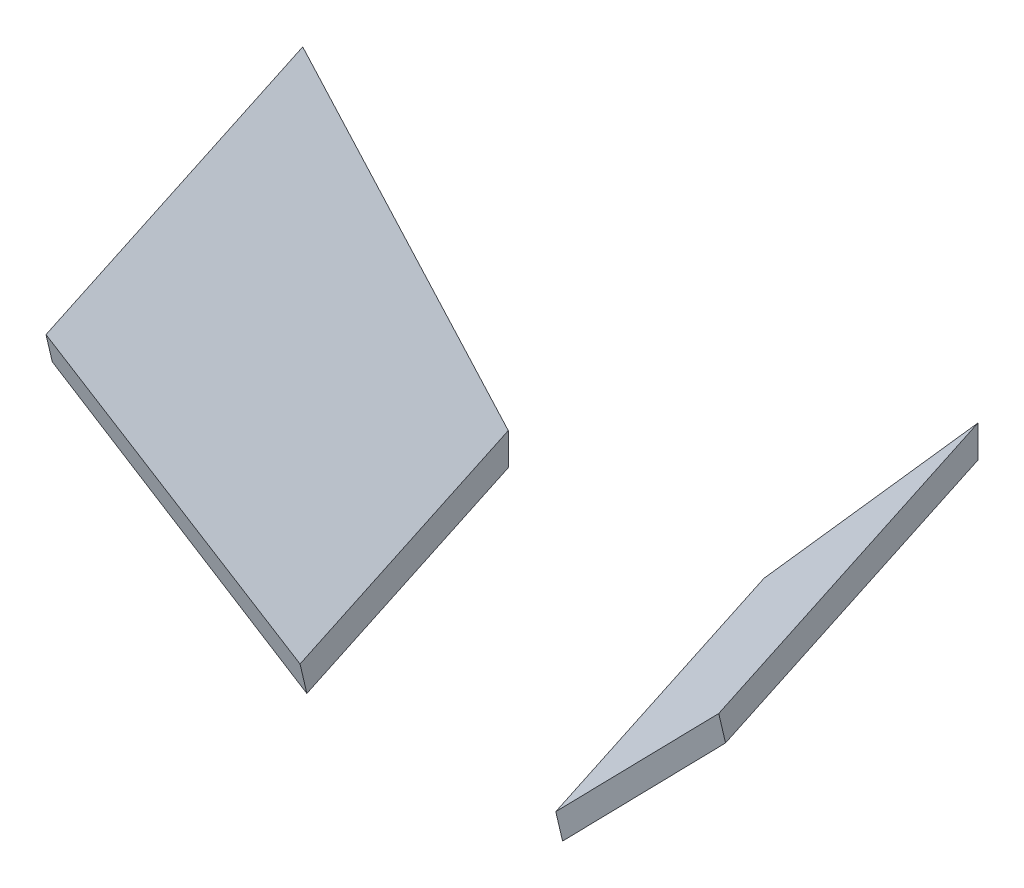
ISO-10303-21;
HEADER;
FILE_DESCRIPTION(('STEP AP214'),'2;1');
FILE_NAME('part.step','',(''),(''),'','','');
FILE_SCHEMA(('AUTOMOTIVE_DESIGN { 1 0 10303 214 1 1 1 1 }'));
ENDSEC;
DATA;
#1=APPLICATION_CONTEXT('core data for automotive mechanical design processes');
#2=APPLICATION_PROTOCOL_DEFINITION('international standard','automotive_design',2000,#1);
#3=PRODUCT_CONTEXT('',#1,'mechanical');
#4=PRODUCT('Part','Part','',(#3));
#5=PRODUCT_RELATED_PRODUCT_CATEGORY('part','',(#4));
#6=PRODUCT_DEFINITION_FORMATION('','',#4);
#7=PRODUCT_DEFINITION_CONTEXT('part definition',#1,'design');
#8=PRODUCT_DEFINITION('design','',#6,#7);
#9=PRODUCT_DEFINITION_SHAPE('','',#8);
#10=(LENGTH_UNIT() NAMED_UNIT(*) SI_UNIT(.MILLI.,.METRE.));
#11=(NAMED_UNIT(*) PLANE_ANGLE_UNIT() SI_UNIT($,.RADIAN.));
#12=(NAMED_UNIT(*) SI_UNIT($,.STERADIAN.) SOLID_ANGLE_UNIT());
#13=UNCERTAINTY_MEASURE_WITH_UNIT(LENGTH_MEASURE(1.E-05),#10,'distance_accuracy_value','');
#14=(GEOMETRIC_REPRESENTATION_CONTEXT(3) GLOBAL_UNCERTAINTY_ASSIGNED_CONTEXT((#13)) GLOBAL_UNIT_ASSIGNED_CONTEXT((#10,
#11,#12)) REPRESENTATION_CONTEXT('',''));
#15=CARTESIAN_POINT('',(0.,0.,0.));
#16=DIRECTION('',(0.,0.,1.));
#17=DIRECTION('',(1.,0.,0.));
#18=AXIS2_PLACEMENT_3D('',#15,#16,#17);
#19=CARTESIAN_POINT('',(189.706249999992,-322.822950045939,490.018989828627));
#20=DIRECTION('',(0.714509515472125,0.633034438721973,0.297898559398576));
#21=DIRECTION('',(-0.663142756427961,0.748492942249375,0.));
#22=AXIS2_PLACEMENT_3D('',#19,#20,#21);
#23=PLANE('',#22);
#24=DIRECTION('',(0.691694025098394,-0.703106373829909,-0.164926658618121));
#25=VECTOR('',#24,1.);
#26=CARTESIAN_POINT('',(225.284806317489,-213.125185193756,171.576093597814));
#27=LINE('',#26,#25);
#28=CARTESIAN_POINT('',(5.95312499998593,9.82527775874656,223.873265492055));
#29=VERTEX_POINT('',#28);
#30=CARTESIAN_POINT('',(189.706249999992,-176.95961369711,180.059400087366));
#31=VERTEX_POINT('',#30);
#32=EDGE_CURVE('E105',#29,#31,#27,.T.);
#33=ORIENTED_EDGE('',*,*,#32,.F.);
#34=DIRECTION('',(0.,0.42579703632988,-0.904818702200994));
#35=VECTOR('',#34,1.);
#36=CARTESIAN_POINT('',(5.95312499998593,-115.419768987876,490.018989828627));
#37=LINE('',#36,#35);
#38=CARTESIAN_POINT('',(5.95312499998593,115.177402696184,0.));
#39=VERTEX_POINT('',#38);
#40=EDGE_CURVE('E12',#29,#39,#37,.T.);
#41=ORIENTED_EDGE('',*,*,#40,.T.);
#42=DIRECTION('',(0.663142756427961,-0.748492942249375,0.));
#43=VECTOR('',#42,1.);
#44=CARTESIAN_POINT('',(189.706249999992,-92.2257783618793,0.));
#45=LINE('',#44,#43);
#46=CARTESIAN_POINT('',(189.706249999992,-92.2257783618793,0.));
#47=VERTEX_POINT('',#46);
#48=EDGE_CURVE('E59',#39,#47,#45,.T.);
#49=ORIENTED_EDGE('',*,*,#48,.T.);
#50=DIRECTION('',(0.,0.42579703632988,-0.904818702200994));
#51=VECTOR('',#50,1.);
#52=CARTESIAN_POINT('',(189.706249999992,-322.822950045939,490.018989828627));
#53=LINE('',#52,#51);
#54=EDGE_CURVE('E112',#31,#47,#53,.T.);
#55=ORIENTED_EDGE('',*,*,#54,.F.);
#56=EDGE_LOOP('',(#33,#41,#49,#55));
#57=FACE_BOUND('',#56,.T.);
#58=ADVANCED_FACE('F49',(#57),#23,.F.);
#59=CARTESIAN_POINT('',(189.706249999992,-294.09717168406,490.018989828627));
#60=DIRECTION('',(-1.,0.,0.));
#61=DIRECTION('',(0.,-1.,0.));
#62=AXIS2_PLACEMENT_3D('',#59,#60,#61);
#63=PLANE('',#62);
#64=DIRECTION('',(0.,0.973574424425513,0.228369963227504));
#65=VECTOR('',#64,1.);
#66=CARTESIAN_POINT('',(189.706249999992,-219.073201766651,170.180875839469));
#67=LINE('',#66,#65);
#68=CARTESIAN_POINT('',(189.706249999992,-151.089511966093,186.127712927948));
#69=VERTEX_POINT('',#68);
#70=EDGE_CURVE('E109',#31,#69,#67,.T.);
#71=ORIENTED_EDGE('',*,*,#70,.F.);
#72=ORIENTED_EDGE('',*,*,#54,.T.);
#73=DIRECTION('',(0.,1.,0.));
#74=VECTOR('',#73,1.);
#75=CARTESIAN_POINT('',(189.706249999992,-63.4999999999998,0.));
#76=LINE('',#75,#74);
#77=CARTESIAN_POINT('',(189.706249999992,-63.4999999999998,0.));
#78=VERTEX_POINT('',#77);
#79=EDGE_CURVE('E119',#47,#78,#76,.T.);
#80=ORIENTED_EDGE('',*,*,#79,.T.);
#81=DIRECTION('',(0.,0.42579703632988,-0.904818702200994));
#82=VECTOR('',#81,1.);
#83=CARTESIAN_POINT('',(189.706249999992,-294.09717168406,490.018989828627));
#84=LINE('',#83,#82);
#85=EDGE_CURVE('E86',#69,#78,#84,.T.);
#86=ORIENTED_EDGE('',*,*,#85,.F.);
#87=EDGE_LOOP('',(#71,#72,#80,#86));
#88=FACE_BOUND('',#87,.T.);
#89=ADVANCED_FACE('F122',(#88),#63,.F.);
#90=CARTESIAN_POINT('',(189.706249999992,-294.09717168406,490.018989828627));
#91=DIRECTION('',(-0.710714360774877,-0.636522495358165,-0.299539997815607));
#92=DIRECTION('',(0.667155791785087,-0.744918216643689,0.));
#93=AXIS2_PLACEMENT_3D('',#90,#91,#92);
#94=PLANE('',#93);
#95=DIRECTION('',(-0.695588381364618,0.699455331281253,0.164070238778343));
#96=VECTOR('',#95,1.);
#97=CARTESIAN_POINT('',(224.602497060017,-186.179755997999,177.896644467066));
#98=LINE('',#97,#96);
#99=CARTESIAN_POINT('',(5.95312499998594,33.6851426488933,229.470039945935));
#100=VERTEX_POINT('',#99);
#101=EDGE_CURVE('E81',#69,#100,#98,.T.);
#102=ORIENTED_EDGE('',*,*,#101,.F.);
#103=ORIENTED_EDGE('',*,*,#85,.T.);
#104=DIRECTION('',(-0.667155791785087,0.744918216643689,0.));
#105=VECTOR('',#104,1.);
#106=CARTESIAN_POINT('',(189.706249999992,-63.4999999999998,0.));
#107=LINE('',#106,#105);
#108=CARTESIAN_POINT('',(5.95312499998594,141.671043799922,0.));
#109=VERTEX_POINT('',#108);
#110=EDGE_CURVE('E99',#78,#109,#107,.T.);
#111=ORIENTED_EDGE('',*,*,#110,.T.);
#112=DIRECTION('',(0.,0.42579703632988,-0.904818702200994));
#113=VECTOR('',#112,1.);
#114=CARTESIAN_POINT('',(5.95312499998594,-88.9261278841382,490.018989828627));
#115=LINE('',#114,#113);
#116=EDGE_CURVE('E93',#100,#109,#115,.T.);
#117=ORIENTED_EDGE('',*,*,#116,.F.);
#118=EDGE_LOOP('',(#102,#103,#111,#117));
#119=FACE_BOUND('',#118,.T.);
#120=ADVANCED_FACE('F102',(#119),#94,.F.);
#121=CARTESIAN_POINT('',(5.95312499998594,-88.9261278841382,490.018989828627));
#122=DIRECTION('',(1.,0.,0.));
#123=DIRECTION('',(0.,1.,0.));
#124=AXIS2_PLACEMENT_3D('',#121,#122,#123);
#125=PLANE('',#124);
#126=DIRECTION('',(0.,-0.973574424425513,-0.228369963227504));
#127=VECTOR('',#126,1.);
#128=CARTESIAN_POINT('',(5.95312499998592,-24.6024106081064,215.797611767908));
#129=LINE('',#128,#127);
#130=EDGE_CURVE('E98',#100,#29,#129,.T.);
#131=ORIENTED_EDGE('',*,*,#130,.F.);
#132=ORIENTED_EDGE('',*,*,#116,.T.);
#133=DIRECTION('',(0.,-1.,0.));
#134=VECTOR('',#133,1.);
#135=CARTESIAN_POINT('',(5.95312499998594,141.671043799922,0.));
#136=LINE('',#135,#134);
#137=EDGE_CURVE('E53',#109,#39,#136,.T.);
#138=ORIENTED_EDGE('',*,*,#137,.T.);
#139=ORIENTED_EDGE('',*,*,#40,.F.);
#140=EDGE_LOOP('',(#131,#132,#138,#139));
#141=FACE_BOUND('',#140,.T.);
#142=ADVANCED_FACE('F94',(#141),#125,.F.);
#143=CARTESIAN_POINT('',(0.,0.,0.));
#144=DIRECTION('',(0.,0.,1.));
#145=DIRECTION('',(1.,0.,0.));
#146=AXIS2_PLACEMENT_3D('',#143,#144,#145);
#147=PLANE('',#146);
#148=ORIENTED_EDGE('',*,*,#48,.F.);
#149=ORIENTED_EDGE('',*,*,#137,.F.);
#150=ORIENTED_EDGE('',*,*,#110,.F.);
#151=ORIENTED_EDGE('',*,*,#79,.F.);
#152=EDGE_LOOP('',(#148,#149,#150,#151));
#153=FACE_BOUND('',#152,.T.);
#154=ADVANCED_FACE('F51',(#153),#147,.F.);
#155=CARTESIAN_POINT('',(-5.37065203274943E-12,189.67011484436,266.059212248137));
#156=DIRECTION('',(0.,-0.228369963227504,0.973574424425513));
#157=DIRECTION('',(-1.,0.,0.));
#158=AXIS2_PLACEMENT_3D('',#155,#156,#157);
#159=PLANE('',#158);
#160=ORIENTED_EDGE('',*,*,#130,.T.);
#161=ORIENTED_EDGE('',*,*,#32,.T.);
#162=ORIENTED_EDGE('',*,*,#70,.T.);
#163=ORIENTED_EDGE('',*,*,#101,.T.);
#164=EDGE_LOOP('',(#160,#161,#162,#163));
#165=FACE_BOUND('',#164,.T.);
#166=ADVANCED_FACE('F130',(#165),#159,.T.);
#167=CLOSED_SHELL('',(#58,#89,#120,#142,#154,#166));
#168=MANIFOLD_SOLID_BREP('B2',#167);
#169=CARTESIAN_POINT('',(418.306249999992,-294.09717168406,490.018989828627));
#170=DIRECTION('',(1.,0.,0.));
#171=DIRECTION('',(0.,0.,-1.));
#172=AXIS2_PLACEMENT_3D('',#169,#170,#171);
#173=PLANE('',#172);
#174=DIRECTION('',(0.,-0.973574424425513,-0.228369963227504));
#175=VECTOR('',#174,1.);
#176=CARTESIAN_POINT('',(418.306249999992,-219.073201766651,170.180875839469));
#177=LINE('',#176,#175);
#178=CARTESIAN_POINT('',(418.306249999992,-151.089511966093,186.127712927948));
#179=VERTEX_POINT('',#178);
#180=CARTESIAN_POINT('',(418.306249999992,-176.95961369711,180.059400087366));
#181=VERTEX_POINT('',#180);
#182=EDGE_CURVE('E223',#179,#181,#177,.T.);
#183=ORIENTED_EDGE('',*,*,#182,.F.);
#184=DIRECTION('',(0.,0.42579703632988,-0.904818702200994));
#185=VECTOR('',#184,1.);
#186=CARTESIAN_POINT('',(418.306249999992,-294.09717168406,490.018989828627));
#187=LINE('',#186,#185);
#188=CARTESIAN_POINT('',(418.306249999992,-63.5,0.));
#189=VERTEX_POINT('',#188);
#190=EDGE_CURVE('E177',#179,#189,#187,.T.);
#191=ORIENTED_EDGE('',*,*,#190,.T.);
#192=DIRECTION('',(0.,-1.,0.));
#193=VECTOR('',#192,1.);
#194=CARTESIAN_POINT('',(418.306249999992,-63.5,0.));
#195=LINE('',#194,#193);
#196=CARTESIAN_POINT('',(418.306249999992,-92.2257783618795,0.));
#197=VERTEX_POINT('',#196);
#198=EDGE_CURVE('E221',#189,#197,#195,.T.);
#199=ORIENTED_EDGE('',*,*,#198,.T.);
#200=DIRECTION('',(0.,0.42579703632988,-0.904818702200994));
#201=VECTOR('',#200,1.);
#202=CARTESIAN_POINT('',(418.306249999992,-322.822950045939,490.018989828627));
#203=LINE('',#202,#201);
#204=EDGE_CURVE('E212',#181,#197,#203,.T.);
#205=ORIENTED_EDGE('',*,*,#204,.F.);
#206=EDGE_LOOP('',(#183,#191,#199,#205));
#207=FACE_BOUND('',#206,.T.);
#208=ADVANCED_FACE('F173',(#207),#173,.F.);
#209=CARTESIAN_POINT('',(418.306249999992,-322.822950045939,490.018989828627));
#210=DIRECTION('',(-0.71448630805304,0.633055883238171,0.29790865093561));
#211=DIRECTION('',(-0.663167408730002,-0.74847110030938,0.));
#212=AXIS2_PLACEMENT_3D('',#209,#210,#211);
#213=PLANE('',#212);
#214=DIRECTION('',(0.691717963279018,0.703084051637308,0.164921422533261));
#215=VECTOR('',#214,1.);
#216=CARTESIAN_POINT('',(382.727591963731,-213.122888864018,171.576632244603));
#217=LINE('',#216,#215);
#218=CARTESIAN_POINT('',(609.599999999992,17.477414026345,225.668216175024));
#219=VERTEX_POINT('',#218);
#220=EDGE_CURVE('E182',#181,#219,#217,.T.);
#221=ORIENTED_EDGE('',*,*,#220,.F.);
#222=ORIENTED_EDGE('',*,*,#204,.T.);
#223=DIRECTION('',(0.663167408730002,0.74847110030938,0.));
#224=VECTOR('',#223,1.);
#225=CARTESIAN_POINT('',(418.306249999992,-92.2257783618795,0.));
#226=LINE('',#225,#224);
#227=CARTESIAN_POINT('',(609.599999999992,123.674221638121,0.));
#228=VERTEX_POINT('',#227);
#229=EDGE_CURVE('E233',#197,#228,#226,.T.);
#230=ORIENTED_EDGE('',*,*,#229,.T.);
#231=DIRECTION('',(0.,0.42579703632988,-0.904818702200994));
#232=VECTOR('',#231,1.);
#233=CARTESIAN_POINT('',(609.599999999992,-106.922950045939,490.018989828627));
#234=LINE('',#233,#232);
#235=EDGE_CURVE('E242',#219,#228,#234,.T.);
#236=ORIENTED_EDGE('',*,*,#235,.F.);
#237=EDGE_LOOP('',(#221,#222,#230,#236));
#238=FACE_BOUND('',#237,.T.);
#239=ADVANCED_FACE('F246',(#238),#213,.F.);
#240=CARTESIAN_POINT('',(609.599999999992,-78.1971716840599,490.018989828627));
#241=DIRECTION('',(-1.,0.,0.));
#242=DIRECTION('',(0.,-1.,0.));
#243=AXIS2_PLACEMENT_3D('',#240,#241,#242);
#244=PLANE('',#243);
#245=DIRECTION('',(0.,0.973574424425513,0.228369963227504));
#246=VECTOR('',#245,1.);
#247=CARTESIAN_POINT('',(609.599999999992,-14.4329999452193,218.183035913062));
#248=LINE('',#247,#246);
#249=CARTESIAN_POINT('',(609.599999999992,43.3475157573619,231.736529015606));
#250=VERTEX_POINT('',#249);
#251=EDGE_CURVE('E47',#219,#250,#248,.T.);
#252=ORIENTED_EDGE('',*,*,#251,.F.);
#253=ORIENTED_EDGE('',*,*,#235,.T.);
#254=DIRECTION('',(0.,1.,0.));
#255=VECTOR('',#254,1.);
#256=CARTESIAN_POINT('',(609.599999999992,152.4,0.));
#257=LINE('',#256,#255);
#258=CARTESIAN_POINT('',(609.599999999992,152.4,0.));
#259=VERTEX_POINT('',#258);
#260=EDGE_CURVE('E243',#228,#259,#257,.T.);
#261=ORIENTED_EDGE('',*,*,#260,.T.);
#262=DIRECTION('',(0.,0.42579703632988,-0.904818702200994));
#263=VECTOR('',#262,1.);
#264=CARTESIAN_POINT('',(609.599999999992,-78.1971716840599,490.018989828627));
#265=LINE('',#264,#263);
#266=EDGE_CURVE('E195',#250,#259,#265,.T.);
#267=ORIENTED_EDGE('',*,*,#266,.F.);
#268=EDGE_LOOP('',(#252,#253,#261,#267));
#269=FACE_BOUND('',#268,.T.);
#270=ADVANCED_FACE('F245',(#269),#244,.F.);
#271=CARTESIAN_POINT('',(418.306249999992,-294.09717168406,490.018989828627));
#272=DIRECTION('',(0.71448630805304,-0.633055883238171,-0.29790865093561));
#273=DIRECTION('',(0.663167408730002,0.74847110030938,0.));
#274=AXIS2_PLACEMENT_3D('',#271,#272,#273);
#275=PLANE('',#274);
#276=DIRECTION('',(-0.691717963279018,-0.703084051637308,-0.164921422533261));
#277=VECTOR('',#276,1.);
#278=CARTESIAN_POINT('',(383.424142206272,-186.544791399635,177.811018633892));
#279=LINE('',#278,#277);
#280=EDGE_CURVE('E230',#250,#179,#279,.T.);
#281=ORIENTED_EDGE('',*,*,#280,.F.);
#282=ORIENTED_EDGE('',*,*,#266,.T.);
#283=DIRECTION('',(-0.663167408730002,-0.74847110030938,0.));
#284=VECTOR('',#283,1.);
#285=CARTESIAN_POINT('',(418.306249999992,-63.5,0.));
#286=LINE('',#285,#284);
#287=EDGE_CURVE('E226',#259,#189,#286,.T.);
#288=ORIENTED_EDGE('',*,*,#287,.T.);
#289=ORIENTED_EDGE('',*,*,#190,.F.);
#290=EDGE_LOOP('',(#281,#282,#288,#289));
#291=FACE_BOUND('',#290,.T.);
#292=ADVANCED_FACE('F227',(#291),#275,.F.);
#293=CARTESIAN_POINT('',(0.,0.,0.));
#294=DIRECTION('',(0.,0.,1.));
#295=DIRECTION('',(1.,0.,0.));
#296=AXIS2_PLACEMENT_3D('',#293,#294,#295);
#297=PLANE('',#296);
#298=ORIENTED_EDGE('',*,*,#198,.F.);
#299=ORIENTED_EDGE('',*,*,#287,.F.);
#300=ORIENTED_EDGE('',*,*,#260,.F.);
#301=ORIENTED_EDGE('',*,*,#229,.F.);
#302=EDGE_LOOP('',(#298,#299,#300,#301));
#303=FACE_BOUND('',#302,.T.);
#304=ADVANCED_FACE('F232',(#303),#297,.F.);
#305=CARTESIAN_POINT('',(-5.37065203274943E-12,189.67011484436,266.059212248137));
#306=DIRECTION('',(0.,-0.228369963227504,0.973574424425513));
#307=DIRECTION('',(-1.,0.,0.));
#308=AXIS2_PLACEMENT_3D('',#305,#306,#307);
#309=PLANE('',#308);
#310=ORIENTED_EDGE('',*,*,#280,.T.);
#311=ORIENTED_EDGE('',*,*,#182,.T.);
#312=ORIENTED_EDGE('',*,*,#220,.T.);
#313=ORIENTED_EDGE('',*,*,#251,.T.);
#314=EDGE_LOOP('',(#310,#311,#312,#313));
#315=FACE_BOUND('',#314,.T.);
#316=ADVANCED_FACE('F175',(#315),#309,.T.);
#317=CLOSED_SHELL('',(#208,#239,#270,#292,#304,#316));
#318=MANIFOLD_SOLID_BREP('B6',#317);
#319=ADVANCED_BREP_SHAPE_REPRESENTATION('',(#18,#168,#318),#14);
#320=SHAPE_DEFINITION_REPRESENTATION(#9,#319);
ENDSEC;
END-ISO-10303-21;
